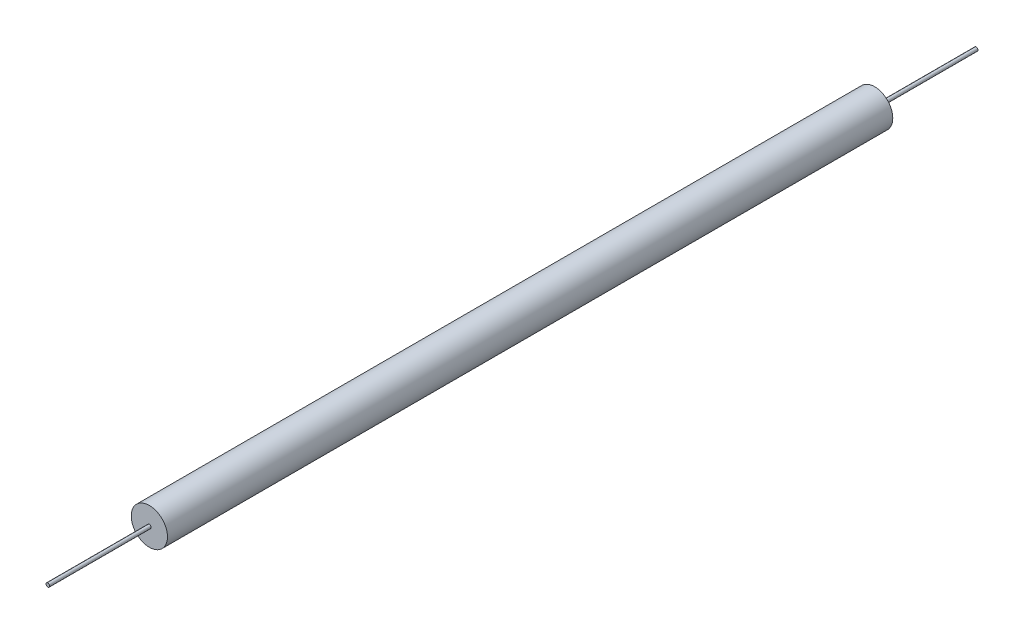
ISO-10303-21;
HEADER;
FILE_DESCRIPTION(('STEP AP214'),'2;1');
FILE_NAME('part.step','',(''),(''),'','','');
FILE_SCHEMA(('AUTOMOTIVE_DESIGN { 1 0 10303 214 1 1 1 1 }'));
ENDSEC;
DATA;
#1=APPLICATION_CONTEXT('core data for automotive mechanical design processes');
#2=APPLICATION_PROTOCOL_DEFINITION('international standard','automotive_design',2000,#1);
#3=PRODUCT_CONTEXT('',#1,'mechanical');
#4=PRODUCT('Part','Part','',(#3));
#5=PRODUCT_RELATED_PRODUCT_CATEGORY('part','',(#4));
#6=PRODUCT_DEFINITION_FORMATION('','',#4);
#7=PRODUCT_DEFINITION_CONTEXT('part definition',#1,'design');
#8=PRODUCT_DEFINITION('design','',#6,#7);
#9=PRODUCT_DEFINITION_SHAPE('','',#8);
#10=(LENGTH_UNIT() NAMED_UNIT(*) SI_UNIT(.MILLI.,.METRE.));
#11=(NAMED_UNIT(*) PLANE_ANGLE_UNIT() SI_UNIT($,.RADIAN.));
#12=(NAMED_UNIT(*) SI_UNIT($,.STERADIAN.) SOLID_ANGLE_UNIT());
#13=UNCERTAINTY_MEASURE_WITH_UNIT(LENGTH_MEASURE(1.E-05),#10,'distance_accuracy_value','');
#14=(GEOMETRIC_REPRESENTATION_CONTEXT(3) GLOBAL_UNCERTAINTY_ASSIGNED_CONTEXT((#13)) GLOBAL_UNIT_ASSIGNED_CONTEXT((#10,
#11,#12)) REPRESENTATION_CONTEXT('',''));
#15=CARTESIAN_POINT('',(0.,0.,0.));
#16=DIRECTION('',(0.,0.,1.));
#17=DIRECTION('',(1.,0.,0.));
#18=AXIS2_PLACEMENT_3D('',#15,#16,#17);
#19=CARTESIAN_POINT('',(0.,0.,-84.));
#20=DIRECTION('',(0.,0.,1.));
#21=DIRECTION('',(1.,0.,0.));
#22=AXIS2_PLACEMENT_3D('',#19,#20,#21);
#23=CYLINDRICAL_SURFACE('',#22,0.5);
#24=CARTESIAN_POINT('',(0.,0.,0.));
#25=DIRECTION('',(0.,0.,1.));
#26=DIRECTION('',(1.,0.,0.));
#27=AXIS2_PLACEMENT_3D('',#24,#25,#26);
#28=CIRCLE('',#27,0.5);
#29=CARTESIAN_POINT('',(0.5,0.,0.));
#30=VERTEX_POINT('',#29);
#31=EDGE_CURVE('E10',#30,#30,#28,.F.);
#32=ORIENTED_EDGE('',*,*,#31,.T.);
#33=EDGE_LOOP('',(#32));
#34=FACE_BOUND('',#33,.T.);
#35=CARTESIAN_POINT('',(0.,0.,-28.));
#36=DIRECTION('',(0.,0.,-1.));
#37=DIRECTION('',(-1.,0.,0.));
#38=AXIS2_PLACEMENT_3D('',#35,#36,#37);
#39=CIRCLE('',#38,0.5);
#40=CARTESIAN_POINT('',(-0.5,0.,-28.));
#41=VERTEX_POINT('',#40);
#42=EDGE_CURVE('E57',#41,#41,#39,.T.);
#43=ORIENTED_EDGE('',*,*,#42,.F.);
#44=EDGE_LOOP('',(#43));
#45=FACE_BOUND('',#44,.T.);
#46=ADVANCED_FACE('F36',(#34,#45),#23,.T.);
#47=CARTESIAN_POINT('',(0.,0.,200.));
#48=DIRECTION('',(0.,0.,-1.));
#49=DIRECTION('',(-1.,0.,0.));
#50=AXIS2_PLACEMENT_3D('',#47,#48,#49);
#51=CYLINDRICAL_SURFACE('',#50,5.);
#52=CARTESIAN_POINT('',(0.,0.,200.));
#53=DIRECTION('',(0.,0.,1.));
#54=DIRECTION('',(1.,0.,0.));
#55=AXIS2_PLACEMENT_3D('',#52,#53,#54);
#56=CIRCLE('',#55,5.);
#57=CARTESIAN_POINT('',(5.,0.,200.));
#58=VERTEX_POINT('',#57);
#59=EDGE_CURVE('E43',#58,#58,#56,.T.);
#60=ORIENTED_EDGE('',*,*,#59,.F.);
#61=EDGE_LOOP('',(#60));
#62=FACE_BOUND('',#61,.T.);
#63=CARTESIAN_POINT('',(0.,0.,0.));
#64=DIRECTION('',(0.,0.,1.));
#65=DIRECTION('',(1.,0.,0.));
#66=AXIS2_PLACEMENT_3D('',#63,#64,#65);
#67=CIRCLE('',#66,5.);
#68=CARTESIAN_POINT('',(5.,0.,0.));
#69=VERTEX_POINT('',#68);
#70=EDGE_CURVE('E47',#69,#69,#67,.T.);
#71=ORIENTED_EDGE('',*,*,#70,.T.);
#72=EDGE_LOOP('',(#71));
#73=FACE_BOUND('',#72,.T.);
#74=ADVANCED_FACE('F38',(#62,#73),#51,.T.);
#75=CARTESIAN_POINT('',(0.,0.,200.));
#76=DIRECTION('',(0.,0.,1.));
#77=DIRECTION('',(1.,0.,0.));
#78=AXIS2_PLACEMENT_3D('',#75,#76,#77);
#79=PLANE('',#78);
#80=CARTESIAN_POINT('',(0.,0.,200.));
#81=DIRECTION('',(0.,0.,1.));
#82=DIRECTION('',(1.,0.,0.));
#83=AXIS2_PLACEMENT_3D('',#80,#81,#82);
#84=CIRCLE('',#83,0.5);
#85=CARTESIAN_POINT('',(0.5,0.,200.));
#86=VERTEX_POINT('',#85);
#87=EDGE_CURVE('E54',#86,#86,#84,.T.);
#88=ORIENTED_EDGE('',*,*,#87,.F.);
#89=EDGE_LOOP('',(#88));
#90=FACE_BOUND('',#89,.T.);
#91=ORIENTED_EDGE('',*,*,#59,.T.);
#92=EDGE_LOOP('',(#91));
#93=FACE_BOUND('',#92,.T.);
#94=ADVANCED_FACE('F72',(#90,#93),#79,.T.);
#95=CARTESIAN_POINT('',(0.,0.,0.));
#96=DIRECTION('',(0.,0.,1.));
#97=DIRECTION('',(1.,0.,0.));
#98=AXIS2_PLACEMENT_3D('',#95,#96,#97);
#99=PLANE('',#98);
#100=ORIENTED_EDGE('',*,*,#31,.F.);
#101=EDGE_LOOP('',(#100));
#102=FACE_BOUND('',#101,.T.);
#103=ORIENTED_EDGE('',*,*,#70,.F.);
#104=EDGE_LOOP('',(#103));
#105=FACE_BOUND('',#104,.T.);
#106=ADVANCED_FACE('F83',(#102,#105),#99,.F.);
#107=CARTESIAN_POINT('',(0.,0.,228.));
#108=DIRECTION('',(0.,0.,-1.));
#109=DIRECTION('',(-1.,0.,0.));
#110=AXIS2_PLACEMENT_3D('',#107,#108,#109);
#111=CYLINDRICAL_SURFACE('',#110,0.5);
#112=CARTESIAN_POINT('',(0.,0.,228.));
#113=DIRECTION('',(0.,0.,1.));
#114=DIRECTION('',(1.,0.,0.));
#115=AXIS2_PLACEMENT_3D('',#112,#113,#114);
#116=CIRCLE('',#115,0.5);
#117=CARTESIAN_POINT('',(0.5,0.,228.));
#118=VERTEX_POINT('',#117);
#119=EDGE_CURVE('E52',#118,#118,#116,.T.);
#120=ORIENTED_EDGE('',*,*,#119,.F.);
#121=EDGE_LOOP('',(#120));
#122=FACE_BOUND('',#121,.T.);
#123=ORIENTED_EDGE('',*,*,#87,.T.);
#124=EDGE_LOOP('',(#123));
#125=FACE_BOUND('',#124,.T.);
#126=ADVANCED_FACE('F79',(#122,#125),#111,.T.);
#127=CARTESIAN_POINT('',(0.,0.,228.));
#128=DIRECTION('',(0.,0.,1.));
#129=DIRECTION('',(1.,0.,0.));
#130=AXIS2_PLACEMENT_3D('',#127,#128,#129);
#131=PLANE('',#130);
#132=ORIENTED_EDGE('',*,*,#119,.T.);
#133=EDGE_LOOP('',(#132));
#134=FACE_BOUND('',#133,.T.);
#135=ADVANCED_FACE('F76',(#134),#131,.T.);
#136=CARTESIAN_POINT('',(0.,0.,-28.));
#137=DIRECTION('',(0.,0.,-1.));
#138=DIRECTION('',(-1.,0.,0.));
#139=AXIS2_PLACEMENT_3D('',#136,#137,#138);
#140=PLANE('',#139);
#141=ORIENTED_EDGE('',*,*,#42,.T.);
#142=EDGE_LOOP('',(#141));
#143=FACE_BOUND('',#142,.T.);
#144=ADVANCED_FACE('F63',(#143),#140,.T.);
#145=CLOSED_SHELL('',(#46,#74,#94,#106,#126,#135,#144));
#146=MANIFOLD_SOLID_BREP('B2',#145);
#147=ADVANCED_BREP_SHAPE_REPRESENTATION('',(#18,#146),#14);
#148=SHAPE_DEFINITION_REPRESENTATION(#9,#147);
ENDSEC;
END-ISO-10303-21;
